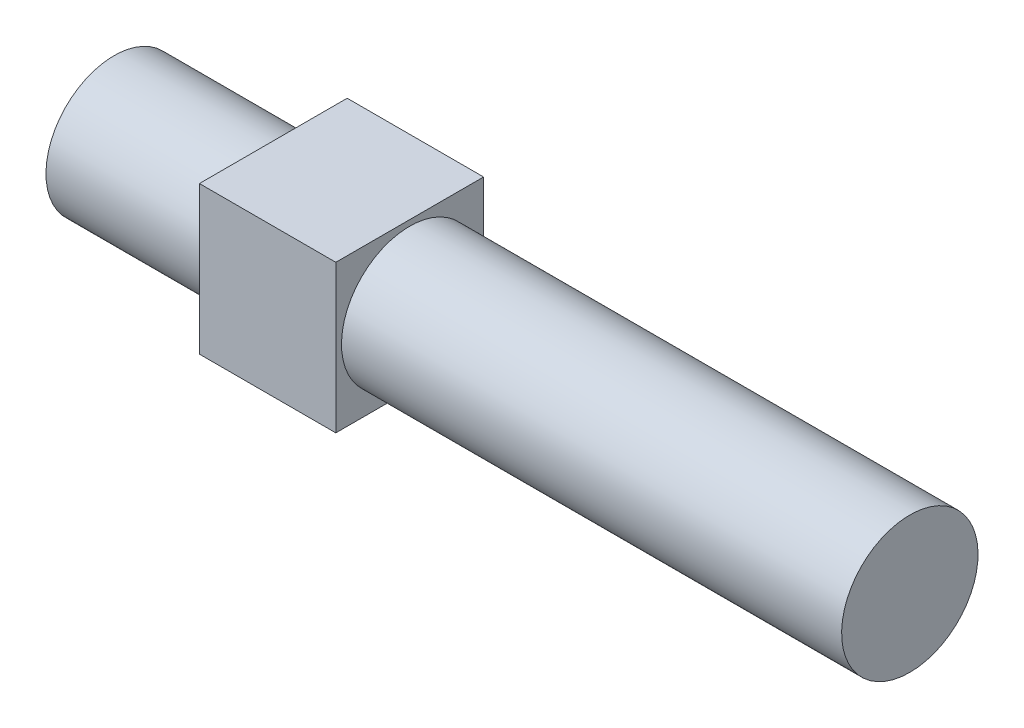
ISO-10303-21;
HEADER;
FILE_DESCRIPTION(('STEP AP214'),'2;1');
FILE_NAME('part.step','',(''),(''),'','','');
FILE_SCHEMA(('AUTOMOTIVE_DESIGN { 1 0 10303 214 1 1 1 1 }'));
ENDSEC;
DATA;
#1=APPLICATION_CONTEXT('core data for automotive mechanical design processes');
#2=APPLICATION_PROTOCOL_DEFINITION('international standard','automotive_design',2000,#1);
#3=PRODUCT_CONTEXT('',#1,'mechanical');
#4=PRODUCT('Part','Part','',(#3));
#5=PRODUCT_RELATED_PRODUCT_CATEGORY('part','',(#4));
#6=PRODUCT_DEFINITION_FORMATION('','',#4);
#7=PRODUCT_DEFINITION_CONTEXT('part definition',#1,'design');
#8=PRODUCT_DEFINITION('design','',#6,#7);
#9=PRODUCT_DEFINITION_SHAPE('','',#8);
#10=(LENGTH_UNIT() NAMED_UNIT(*) SI_UNIT(.MILLI.,.METRE.));
#11=(NAMED_UNIT(*) PLANE_ANGLE_UNIT() SI_UNIT($,.RADIAN.));
#12=(NAMED_UNIT(*) SI_UNIT($,.STERADIAN.) SOLID_ANGLE_UNIT());
#13=UNCERTAINTY_MEASURE_WITH_UNIT(LENGTH_MEASURE(1.E-05),#10,'distance_accuracy_value','');
#14=(GEOMETRIC_REPRESENTATION_CONTEXT(3) GLOBAL_UNCERTAINTY_ASSIGNED_CONTEXT((#13)) GLOBAL_UNIT_ASSIGNED_CONTEXT((#10,
#11,#12)) REPRESENTATION_CONTEXT('',''));
#15=CARTESIAN_POINT('',(0.,0.,0.));
#16=DIRECTION('',(0.,0.,1.));
#17=DIRECTION('',(1.,0.,0.));
#18=AXIS2_PLACEMENT_3D('',#15,#16,#17);
#19=CARTESIAN_POINT('',(0.,-6.,0.));
#20=DIRECTION('',(-1.,0.,0.));
#21=DIRECTION('',(0.,-1.,0.));
#22=AXIS2_PLACEMENT_3D('',#19,#20,#21);
#23=CYLINDRICAL_SURFACE('',#22,6.);
#24=CARTESIAN_POINT('',(26.,-6.,0.));
#25=DIRECTION('',(1.,0.,0.));
#26=DIRECTION('',(0.,0.,-1.));
#27=AXIS2_PLACEMENT_3D('',#24,#25,#26);
#28=CIRCLE('',#27,6.);
#29=CARTESIAN_POINT('',(26.,-6.,-6.));
#30=VERTEX_POINT('',#29);
#31=EDGE_CURVE('E41',#30,#30,#28,.T.);
#32=ORIENTED_EDGE('',*,*,#31,.T.);
#33=EDGE_LOOP('',(#32));
#34=FACE_BOUND('',#33,.T.);
#35=CARTESIAN_POINT('',(70.,-6.,0.));
#36=DIRECTION('',(-1.,0.,0.));
#37=DIRECTION('',(0.,-1.,0.));
#38=AXIS2_PLACEMENT_3D('',#35,#36,#37);
#39=CIRCLE('',#38,6.);
#40=CARTESIAN_POINT('',(70.,-12.,0.));
#41=VERTEX_POINT('',#40);
#42=EDGE_CURVE('E115',#41,#41,#39,.T.);
#43=ORIENTED_EDGE('',*,*,#42,.T.);
#44=EDGE_LOOP('',(#43));
#45=FACE_BOUND('',#44,.T.);
#46=ADVANCED_FACE('F37',(#34,#45),#23,.T.);
#47=CARTESIAN_POINT('',(70.,0.,0.));
#48=DIRECTION('',(-1.,0.,0.));
#49=DIRECTION('',(0.,-1.,0.));
#50=AXIS2_PLACEMENT_3D('',#47,#48,#49);
#51=PLANE('',#50);
#52=ORIENTED_EDGE('',*,*,#42,.F.);
#53=EDGE_LOOP('',(#52));
#54=FACE_BOUND('',#53,.T.);
#55=ADVANCED_FACE('F145',(#54),#51,.F.);
#56=CARTESIAN_POINT('',(26.,0.500000000000002,-6.5));
#57=DIRECTION('',(0.,0.,1.));
#58=DIRECTION('',(0.,-1.,0.));
#59=AXIS2_PLACEMENT_3D('',#56,#57,#58);
#60=PLANE('',#59);
#61=DIRECTION('',(0.,1.,0.));
#62=VECTOR('',#61,1.);
#63=CARTESIAN_POINT('',(14.,0.500000000000002,-6.5));
#64=LINE('',#63,#62);
#65=CARTESIAN_POINT('',(14.,-12.5,-6.5));
#66=VERTEX_POINT('',#65);
#67=CARTESIAN_POINT('',(14.,0.500000000000002,-6.5));
#68=VERTEX_POINT('',#67);
#69=EDGE_CURVE('E106',#66,#68,#64,.T.);
#70=ORIENTED_EDGE('',*,*,#69,.T.);
#71=DIRECTION('',(-1.,0.,0.));
#72=VECTOR('',#71,1.);
#73=CARTESIAN_POINT('',(26.,0.500000000000002,-6.5));
#74=LINE('',#73,#72);
#75=CARTESIAN_POINT('',(26.,0.500000000000002,-6.5));
#76=VERTEX_POINT('',#75);
#77=EDGE_CURVE('E97',#76,#68,#74,.T.);
#78=ORIENTED_EDGE('',*,*,#77,.F.);
#79=DIRECTION('',(0.,1.,0.));
#80=VECTOR('',#79,1.);
#81=CARTESIAN_POINT('',(26.,0.500000000000002,-6.5));
#82=LINE('',#81,#80);
#83=CARTESIAN_POINT('',(26.,-12.5,-6.5));
#84=VERTEX_POINT('',#83);
#85=EDGE_CURVE('E91',#84,#76,#82,.T.);
#86=ORIENTED_EDGE('',*,*,#85,.F.);
#87=DIRECTION('',(-1.,0.,0.));
#88=VECTOR('',#87,1.);
#89=CARTESIAN_POINT('',(26.,-12.5,-6.5));
#90=LINE('',#89,#88);
#91=EDGE_CURVE('E102',#84,#66,#90,.T.);
#92=ORIENTED_EDGE('',*,*,#91,.T.);
#93=EDGE_LOOP('',(#70,#78,#86,#92));
#94=FACE_BOUND('',#93,.T.);
#95=ADVANCED_FACE('F133',(#94),#60,.F.);
#96=CARTESIAN_POINT('',(26.,0.500000000000002,6.5));
#97=DIRECTION('',(0.,-1.,0.));
#98=DIRECTION('',(0.,0.,-1.));
#99=AXIS2_PLACEMENT_3D('',#96,#97,#98);
#100=PLANE('',#99);
#101=DIRECTION('',(0.,0.,1.));
#102=VECTOR('',#101,1.);
#103=CARTESIAN_POINT('',(14.,0.500000000000002,6.5));
#104=LINE('',#103,#102);
#105=CARTESIAN_POINT('',(14.,0.500000000000002,6.5));
#106=VERTEX_POINT('',#105);
#107=EDGE_CURVE('E96',#68,#106,#104,.T.);
#108=ORIENTED_EDGE('',*,*,#107,.T.);
#109=DIRECTION('',(-1.,0.,0.));
#110=VECTOR('',#109,1.);
#111=CARTESIAN_POINT('',(26.,0.500000000000002,6.5));
#112=LINE('',#111,#110);
#113=CARTESIAN_POINT('',(26.,0.500000000000002,6.5));
#114=VERTEX_POINT('',#113);
#115=EDGE_CURVE('E94',#114,#106,#112,.T.);
#116=ORIENTED_EDGE('',*,*,#115,.F.);
#117=DIRECTION('',(0.,0.,1.));
#118=VECTOR('',#117,1.);
#119=CARTESIAN_POINT('',(26.,0.500000000000002,6.5));
#120=LINE('',#119,#118);
#121=EDGE_CURVE('E86',#76,#114,#120,.T.);
#122=ORIENTED_EDGE('',*,*,#121,.F.);
#123=ORIENTED_EDGE('',*,*,#77,.T.);
#124=EDGE_LOOP('',(#108,#116,#122,#123));
#125=FACE_BOUND('',#124,.T.);
#126=ADVANCED_FACE('F95',(#125),#100,.F.);
#127=CARTESIAN_POINT('',(26.,0.500000000000002,6.5));
#128=DIRECTION('',(0.,0.,-1.));
#129=DIRECTION('',(0.,1.,0.));
#130=AXIS2_PLACEMENT_3D('',#127,#128,#129);
#131=PLANE('',#130);
#132=DIRECTION('',(0.,-1.,0.));
#133=VECTOR('',#132,1.);
#134=CARTESIAN_POINT('',(14.,0.500000000000002,6.5));
#135=LINE('',#134,#133);
#136=CARTESIAN_POINT('',(14.,-12.5,6.5));
#137=VERTEX_POINT('',#136);
#138=EDGE_CURVE('E72',#106,#137,#135,.T.);
#139=ORIENTED_EDGE('',*,*,#138,.T.);
#140=DIRECTION('',(-1.,0.,0.));
#141=VECTOR('',#140,1.);
#142=CARTESIAN_POINT('',(26.,-12.5,6.5));
#143=LINE('',#142,#141);
#144=CARTESIAN_POINT('',(26.,-12.5,6.5));
#145=VERTEX_POINT('',#144);
#146=EDGE_CURVE('E98',#145,#137,#143,.T.);
#147=ORIENTED_EDGE('',*,*,#146,.F.);
#148=DIRECTION('',(0.,-1.,0.));
#149=VECTOR('',#148,1.);
#150=CARTESIAN_POINT('',(26.,0.500000000000002,6.5));
#151=LINE('',#150,#149);
#152=EDGE_CURVE('E89',#114,#145,#151,.T.);
#153=ORIENTED_EDGE('',*,*,#152,.F.);
#154=ORIENTED_EDGE('',*,*,#115,.T.);
#155=EDGE_LOOP('',(#139,#147,#153,#154));
#156=FACE_BOUND('',#155,.T.);
#157=ADVANCED_FACE('F100',(#156),#131,.F.);
#158=CARTESIAN_POINT('',(26.,-12.5,6.5));
#159=DIRECTION('',(0.,1.,0.));
#160=DIRECTION('',(0.,0.,1.));
#161=AXIS2_PLACEMENT_3D('',#158,#159,#160);
#162=PLANE('',#161);
#163=DIRECTION('',(0.,0.,-1.));
#164=VECTOR('',#163,1.);
#165=CARTESIAN_POINT('',(14.,-12.5,6.5));
#166=LINE('',#165,#164);
#167=EDGE_CURVE('E78',#137,#66,#166,.T.);
#168=ORIENTED_EDGE('',*,*,#167,.T.);
#169=ORIENTED_EDGE('',*,*,#91,.F.);
#170=DIRECTION('',(0.,0.,-1.));
#171=VECTOR('',#170,1.);
#172=CARTESIAN_POINT('',(26.,-12.5,6.5));
#173=LINE('',#172,#171);
#174=EDGE_CURVE('E55',#145,#84,#173,.T.);
#175=ORIENTED_EDGE('',*,*,#174,.F.);
#176=ORIENTED_EDGE('',*,*,#146,.T.);
#177=EDGE_LOOP('',(#168,#169,#175,#176));
#178=FACE_BOUND('',#177,.T.);
#179=ADVANCED_FACE('F134',(#178),#162,.F.);
#180=CARTESIAN_POINT('',(26.,0.,0.));
#181=DIRECTION('',(1.,0.,0.));
#182=DIRECTION('',(0.,0.,-1.));
#183=AXIS2_PLACEMENT_3D('',#180,#181,#182);
#184=PLANE('',#183);
#185=ORIENTED_EDGE('',*,*,#31,.F.);
#186=EDGE_LOOP('',(#185));
#187=FACE_BOUND('',#186,.T.);
#188=ORIENTED_EDGE('',*,*,#85,.T.);
#189=ORIENTED_EDGE('',*,*,#121,.T.);
#190=ORIENTED_EDGE('',*,*,#152,.T.);
#191=ORIENTED_EDGE('',*,*,#174,.T.);
#192=EDGE_LOOP('',(#188,#189,#190,#191));
#193=FACE_BOUND('',#192,.T.);
#194=ADVANCED_FACE('F87',(#187,#193),#184,.T.);
#195=CARTESIAN_POINT('',(14.,0.,0.));
#196=DIRECTION('',(1.,0.,0.));
#197=DIRECTION('',(0.,0.,-1.));
#198=AXIS2_PLACEMENT_3D('',#195,#196,#197);
#199=PLANE('',#198);
#200=CARTESIAN_POINT('',(14.,-6.,0.));
#201=DIRECTION('',(1.,0.,0.));
#202=DIRECTION('',(0.,0.,-1.));
#203=AXIS2_PLACEMENT_3D('',#200,#201,#202);
#204=CIRCLE('',#203,6.);
#205=CARTESIAN_POINT('',(14.,-6.,-6.));
#206=VERTEX_POINT('',#205);
#207=EDGE_CURVE('E11',#206,#206,#204,.T.);
#208=ORIENTED_EDGE('',*,*,#207,.T.);
#209=EDGE_LOOP('',(#208));
#210=FACE_BOUND('',#209,.T.);
#211=ORIENTED_EDGE('',*,*,#69,.F.);
#212=ORIENTED_EDGE('',*,*,#167,.F.);
#213=ORIENTED_EDGE('',*,*,#138,.F.);
#214=ORIENTED_EDGE('',*,*,#107,.F.);
#215=EDGE_LOOP('',(#211,#212,#213,#214));
#216=FACE_BOUND('',#215,.T.);
#217=ADVANCED_FACE('F127',(#210,#216),#199,.F.);
#218=CARTESIAN_POINT('',(0.,-6.,0.));
#219=DIRECTION('',(1.,0.,0.));
#220=DIRECTION('',(0.,1.,0.));
#221=AXIS2_PLACEMENT_3D('',#218,#219,#220);
#222=PLANE('',#221);
#223=CARTESIAN_POINT('',(0.,-6.,0.));
#224=DIRECTION('',(-1.,0.,0.));
#225=DIRECTION('',(0.,-1.,0.));
#226=AXIS2_PLACEMENT_3D('',#223,#224,#225);
#227=CIRCLE('',#226,6.);
#228=CARTESIAN_POINT('',(0.,-12.,0.));
#229=VERTEX_POINT('',#228);
#230=EDGE_CURVE('E47',#229,#229,#227,.T.);
#231=ORIENTED_EDGE('',*,*,#230,.T.);
#232=EDGE_LOOP('',(#231));
#233=FACE_BOUND('',#232,.T.);
#234=ADVANCED_FACE('F39',(#233),#222,.F.);
#235=ORIENTED_EDGE('',*,*,#230,.F.);
#236=EDGE_LOOP('',(#235));
#237=FACE_BOUND('',#236,.T.);
#238=ORIENTED_EDGE('',*,*,#207,.F.);
#239=EDGE_LOOP('',(#238));
#240=FACE_BOUND('',#239,.T.);
#241=ADVANCED_FACE('F122',(#237,#240),#23,.T.);
#242=CLOSED_SHELL('',(#46,#55,#95,#126,#157,#179,#194,#217,#234,#241));
#243=MANIFOLD_SOLID_BREP('B2',#242);
#244=ADVANCED_BREP_SHAPE_REPRESENTATION('',(#18,#243),#14);
#245=SHAPE_DEFINITION_REPRESENTATION(#9,#244);
ENDSEC;
END-ISO-10303-21;
